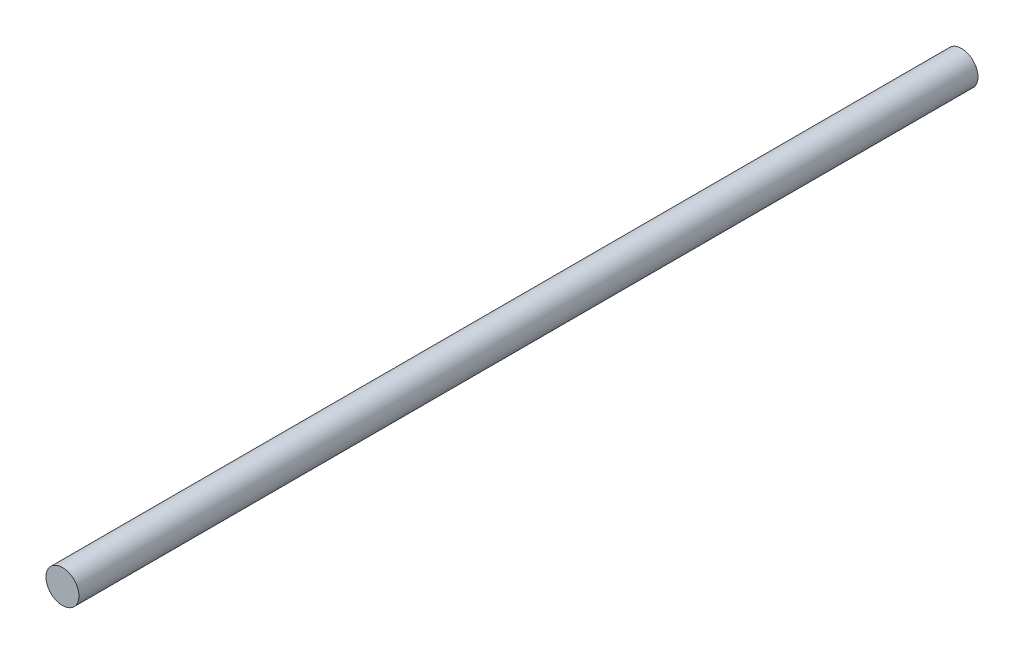
ISO-10303-21;
HEADER;
FILE_DESCRIPTION(('STEP AP214'),'2;1');
FILE_NAME('part.step','',(''),(''),'','','');
FILE_SCHEMA(('AUTOMOTIVE_DESIGN { 1 0 10303 214 1 1 1 1 }'));
ENDSEC;
DATA;
#1=APPLICATION_CONTEXT('core data for automotive mechanical design processes');
#2=APPLICATION_PROTOCOL_DEFINITION('international standard','automotive_design',2000,#1);
#3=PRODUCT_CONTEXT('',#1,'mechanical');
#4=PRODUCT('Part','Part','',(#3));
#5=PRODUCT_RELATED_PRODUCT_CATEGORY('part','',(#4));
#6=PRODUCT_DEFINITION_FORMATION('','',#4);
#7=PRODUCT_DEFINITION_CONTEXT('part definition',#1,'design');
#8=PRODUCT_DEFINITION('design','',#6,#7);
#9=PRODUCT_DEFINITION_SHAPE('','',#8);
#10=(LENGTH_UNIT() NAMED_UNIT(*) SI_UNIT(.MILLI.,.METRE.));
#11=(NAMED_UNIT(*) PLANE_ANGLE_UNIT() SI_UNIT($,.RADIAN.));
#12=(NAMED_UNIT(*) SI_UNIT($,.STERADIAN.) SOLID_ANGLE_UNIT());
#13=UNCERTAINTY_MEASURE_WITH_UNIT(LENGTH_MEASURE(1.E-05),#10,'distance_accuracy_value','');
#14=(GEOMETRIC_REPRESENTATION_CONTEXT(3) GLOBAL_UNCERTAINTY_ASSIGNED_CONTEXT((#13)) GLOBAL_UNIT_ASSIGNED_CONTEXT((#10,
#11,#12)) REPRESENTATION_CONTEXT('',''));
#15=CARTESIAN_POINT('',(0.,0.,0.));
#16=DIRECTION('',(0.,0.,1.));
#17=DIRECTION('',(1.,0.,0.));
#18=AXIS2_PLACEMENT_3D('',#15,#16,#17);
#19=CARTESIAN_POINT('',(0.,0.,150.));
#20=DIRECTION('',(0.,0.,-1.));
#21=DIRECTION('',(-1.,0.,0.));
#22=AXIS2_PLACEMENT_3D('',#19,#20,#21);
#23=CYLINDRICAL_SURFACE('',#22,2.75);
#24=CARTESIAN_POINT('',(0.,0.,150.));
#25=DIRECTION('',(0.,0.,1.));
#26=DIRECTION('',(1.,0.,0.));
#27=AXIS2_PLACEMENT_3D('',#24,#25,#26);
#28=CIRCLE('',#27,2.75);
#29=CARTESIAN_POINT('',(2.75,0.,150.));
#30=VERTEX_POINT('',#29);
#31=EDGE_CURVE('E10',#30,#30,#28,.T.);
#32=ORIENTED_EDGE('',*,*,#31,.F.);
#33=EDGE_LOOP('',(#32));
#34=FACE_BOUND('',#33,.T.);
#35=CARTESIAN_POINT('',(0.,0.,0.));
#36=DIRECTION('',(0.,0.,1.));
#37=DIRECTION('',(1.,0.,0.));
#38=AXIS2_PLACEMENT_3D('',#35,#36,#37);
#39=CIRCLE('',#38,2.75);
#40=CARTESIAN_POINT('',(2.75,0.,0.));
#41=VERTEX_POINT('',#40);
#42=EDGE_CURVE('E34',#41,#41,#39,.T.);
#43=ORIENTED_EDGE('',*,*,#42,.T.);
#44=EDGE_LOOP('',(#43));
#45=FACE_BOUND('',#44,.T.);
#46=ADVANCED_FACE('F31',(#34,#45),#23,.T.);
#47=CARTESIAN_POINT('',(0.,0.,150.));
#48=DIRECTION('',(0.,0.,1.));
#49=DIRECTION('',(1.,0.,0.));
#50=AXIS2_PLACEMENT_3D('',#47,#48,#49);
#51=PLANE('',#50);
#52=ORIENTED_EDGE('',*,*,#31,.T.);
#53=EDGE_LOOP('',(#52));
#54=FACE_BOUND('',#53,.T.);
#55=ADVANCED_FACE('F46',(#54),#51,.T.);
#56=CARTESIAN_POINT('',(0.,0.,0.));
#57=DIRECTION('',(0.,0.,1.));
#58=DIRECTION('',(1.,0.,0.));
#59=AXIS2_PLACEMENT_3D('',#56,#57,#58);
#60=PLANE('',#59);
#61=ORIENTED_EDGE('',*,*,#42,.F.);
#62=EDGE_LOOP('',(#61));
#63=FACE_BOUND('',#62,.T.);
#64=ADVANCED_FACE('F44',(#63),#60,.F.);
#65=CLOSED_SHELL('',(#46,#55,#64));
#66=MANIFOLD_SOLID_BREP('B2',#65);
#67=ADVANCED_BREP_SHAPE_REPRESENTATION('',(#18,#66),#14);
#68=SHAPE_DEFINITION_REPRESENTATION(#9,#67);
ENDSEC;
END-ISO-10303-21;
